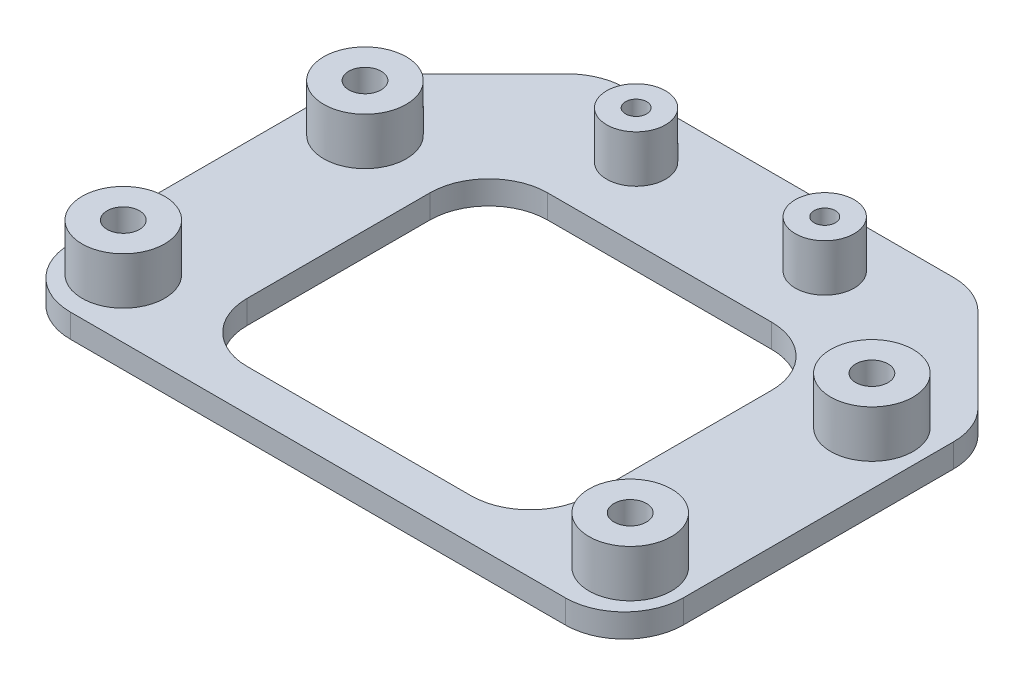
ISO-10303-21;
HEADER;
FILE_DESCRIPTION(('STEP AP214'),'2;1');
FILE_NAME('part.step','',(''),(''),'','','');
FILE_SCHEMA(('AUTOMOTIVE_DESIGN { 1 0 10303 214 1 1 1 1 }'));
ENDSEC;
DATA;
#1=APPLICATION_CONTEXT('core data for automotive mechanical design processes');
#2=APPLICATION_PROTOCOL_DEFINITION('international standard','automotive_design',2000,#1);
#3=PRODUCT_CONTEXT('',#1,'mechanical');
#4=PRODUCT('Part','Part','',(#3));
#5=PRODUCT_RELATED_PRODUCT_CATEGORY('part','',(#4));
#6=PRODUCT_DEFINITION_FORMATION('','',#4);
#7=PRODUCT_DEFINITION_CONTEXT('part definition',#1,'design');
#8=PRODUCT_DEFINITION('design','',#6,#7);
#9=PRODUCT_DEFINITION_SHAPE('','',#8);
#10=(LENGTH_UNIT() NAMED_UNIT(*) SI_UNIT(.MILLI.,.METRE.));
#11=(NAMED_UNIT(*) PLANE_ANGLE_UNIT() SI_UNIT($,.RADIAN.));
#12=(NAMED_UNIT(*) SI_UNIT($,.STERADIAN.) SOLID_ANGLE_UNIT());
#13=UNCERTAINTY_MEASURE_WITH_UNIT(LENGTH_MEASURE(1.E-05),#10,'distance_accuracy_value','');
#14=(GEOMETRIC_REPRESENTATION_CONTEXT(3) GLOBAL_UNCERTAINTY_ASSIGNED_CONTEXT((#13)) GLOBAL_UNIT_ASSIGNED_CONTEXT((#10,
#11,#12)) REPRESENTATION_CONTEXT('',''));
#15=CARTESIAN_POINT('',(0.,0.,0.));
#16=DIRECTION('',(0.,0.,1.));
#17=DIRECTION('',(1.,0.,0.));
#18=AXIS2_PLACEMENT_3D('',#15,#16,#17);
#19=CARTESIAN_POINT('',(0.,2.,0.));
#20=DIRECTION('',(0.,-1.,0.));
#21=DIRECTION('',(0.,0.,-1.));
#22=AXIS2_PLACEMENT_3D('',#19,#20,#21);
#23=PLANE('',#22);
#24=DIRECTION('',(-1.,0.,0.));
#25=VECTOR('',#24,1.);
#26=CARTESIAN_POINT('',(-14.5,2.,-9.00000000000001));
#27=LINE('',#26,#25);
#28=CARTESIAN_POINT('',(9.49999999999999,2.,-9.00000000000001));
#29=VERTEX_POINT('',#28);
#30=CARTESIAN_POINT('',(-9.5,2.,-9.00000000000001));
#31=VERTEX_POINT('',#30);
#32=EDGE_CURVE('E217',#29,#31,#27,.T.);
#33=ORIENTED_EDGE('',*,*,#32,.F.);
#34=CARTESIAN_POINT('',(9.5,2.,-4.));
#35=DIRECTION('',(0.,-1.,0.));
#36=DIRECTION('',(0.,0.,-1.));
#37=AXIS2_PLACEMENT_3D('',#34,#35,#36);
#38=CIRCLE('',#37,5.);
#39=CARTESIAN_POINT('',(14.5,2.,-4.));
#40=VERTEX_POINT('',#39);
#41=EDGE_CURVE('E465',#29,#40,#38,.T.);
#42=ORIENTED_EDGE('',*,*,#41,.T.);
#43=DIRECTION('',(0.,0.,-1.));
#44=VECTOR('',#43,1.);
#45=CARTESIAN_POINT('',(14.5,2.,16.5));
#46=LINE('',#45,#44);
#47=CARTESIAN_POINT('',(14.5,2.,11.5));
#48=VERTEX_POINT('',#47);
#49=EDGE_CURVE('E481',#48,#40,#46,.T.);
#50=ORIENTED_EDGE('',*,*,#49,.F.);
#51=CARTESIAN_POINT('',(9.5,2.,11.5));
#52=DIRECTION('',(0.,-1.,0.));
#53=DIRECTION('',(0.,0.,-1.));
#54=AXIS2_PLACEMENT_3D('',#51,#52,#53);
#55=CIRCLE('',#54,5.);
#56=CARTESIAN_POINT('',(9.5,2.,16.5));
#57=VERTEX_POINT('',#56);
#58=EDGE_CURVE('E207',#48,#57,#55,.T.);
#59=ORIENTED_EDGE('',*,*,#58,.T.);
#60=DIRECTION('',(1.,0.,0.));
#61=VECTOR('',#60,1.);
#62=CARTESIAN_POINT('',(-14.5,2.,16.5));
#63=LINE('',#62,#61);
#64=CARTESIAN_POINT('',(-9.5,2.,16.5));
#65=VERTEX_POINT('',#64);
#66=EDGE_CURVE('E196',#65,#57,#63,.T.);
#67=ORIENTED_EDGE('',*,*,#66,.F.);
#68=CARTESIAN_POINT('',(-9.5,2.,11.5));
#69=DIRECTION('',(0.,-1.,0.));
#70=DIRECTION('',(0.,0.,-1.));
#71=AXIS2_PLACEMENT_3D('',#68,#69,#70);
#72=CIRCLE('',#71,5.);
#73=CARTESIAN_POINT('',(-14.5,2.,11.5));
#74=VERTEX_POINT('',#73);
#75=EDGE_CURVE('E178',#65,#74,#72,.T.);
#76=ORIENTED_EDGE('',*,*,#75,.T.);
#77=DIRECTION('',(0.,0.,1.));
#78=VECTOR('',#77,1.);
#79=CARTESIAN_POINT('',(-14.5,2.,16.5));
#80=LINE('',#79,#78);
#81=CARTESIAN_POINT('',(-14.5,2.,-4.));
#82=VERTEX_POINT('',#81);
#83=EDGE_CURVE('E210',#82,#74,#80,.T.);
#84=ORIENTED_EDGE('',*,*,#83,.F.);
#85=CARTESIAN_POINT('',(-9.5,2.,-4.));
#86=DIRECTION('',(0.,-1.,0.));
#87=DIRECTION('',(0.,0.,-1.));
#88=AXIS2_PLACEMENT_3D('',#85,#86,#87);
#89=CIRCLE('',#88,5.);
#90=EDGE_CURVE('E48',#82,#31,#89,.T.);
#91=ORIENTED_EDGE('',*,*,#90,.T.);
#92=EDGE_LOOP('',(#33,#42,#50,#59,#67,#76,#84,#91));
#93=FACE_BOUND('',#92,.T.);
#94=CARTESIAN_POINT('',(8.,2.,-15.));
#95=DIRECTION('',(0.,-1.,0.));
#96=DIRECTION('',(0.,0.,-1.));
#97=AXIS2_PLACEMENT_3D('',#94,#95,#96);
#98=CIRCLE('',#97,2.5);
#99=CARTESIAN_POINT('',(8.,2.,-17.5));
#100=VERTEX_POINT('',#99);
#101=EDGE_CURVE('E338',#100,#100,#98,.F.);
#102=ORIENTED_EDGE('',*,*,#101,.F.);
#103=EDGE_LOOP('',(#102));
#104=FACE_BOUND('',#103,.T.);
#105=CARTESIAN_POINT('',(21.5,2.,15.));
#106=DIRECTION('',(0.,-1.,0.));
#107=DIRECTION('',(0.,0.,-1.));
#108=AXIS2_PLACEMENT_3D('',#105,#106,#107);
#109=CIRCLE('',#108,3.5);
#110=CARTESIAN_POINT('',(21.5,2.,11.5));
#111=VERTEX_POINT('',#110);
#112=EDGE_CURVE('E330',#111,#111,#109,.F.);
#113=ORIENTED_EDGE('',*,*,#112,.F.);
#114=EDGE_LOOP('',(#113));
#115=FACE_BOUND('',#114,.T.);
#116=CARTESIAN_POINT('',(-21.5,2.,-5.5));
#117=DIRECTION('',(0.,-1.,0.));
#118=DIRECTION('',(0.,0.,-1.));
#119=AXIS2_PLACEMENT_3D('',#116,#117,#118);
#120=CIRCLE('',#119,3.5);
#121=CARTESIAN_POINT('',(-21.5,2.,-9.));
#122=VERTEX_POINT('',#121);
#123=EDGE_CURVE('E309',#122,#122,#120,.F.);
#124=ORIENTED_EDGE('',*,*,#123,.F.);
#125=EDGE_LOOP('',(#124));
#126=FACE_BOUND('',#125,.T.);
#127=DIRECTION('',(0.707106781186548,0.,-0.707106781186547));
#128=VECTOR('',#127,1.);
#129=CARTESIAN_POINT('',(-26.,2.,-10.));
#130=LINE('',#129,#128);
#131=CARTESIAN_POINT('',(-17.4644660940672,2.,-18.5355339059327));
#132=VERTEX_POINT('',#131);
#133=CARTESIAN_POINT('',(-24.5355339059327,2.,-11.4644660940673));
#134=VERTEX_POINT('',#133);
#135=EDGE_CURVE('E354',#132,#134,#130,.F.);
#136=ORIENTED_EDGE('',*,*,#135,.T.);
#137=CARTESIAN_POINT('',(-21.,2.,-7.92893218813452));
#138=DIRECTION('',(0.,-1.,0.));
#139=DIRECTION('',(0.,0.,-1.));
#140=AXIS2_PLACEMENT_3D('',#137,#138,#139);
#141=CIRCLE('',#140,5.);
#142=CARTESIAN_POINT('',(-26.,2.,-7.92893218813452));
#143=VERTEX_POINT('',#142);
#144=EDGE_CURVE('E428',#134,#143,#141,.F.);
#145=ORIENTED_EDGE('',*,*,#144,.T.);
#146=DIRECTION('',(0.,0.,1.));
#147=VECTOR('',#146,1.);
#148=CARTESIAN_POINT('',(-26.,2.,20.));
#149=LINE('',#148,#147);
#150=CARTESIAN_POINT('',(-26.,2.,15.));
#151=VERTEX_POINT('',#150);
#152=EDGE_CURVE('E303',#143,#151,#149,.T.);
#153=ORIENTED_EDGE('',*,*,#152,.T.);
#154=CARTESIAN_POINT('',(-21.,2.,15.));
#155=DIRECTION('',(0.,-1.,0.));
#156=DIRECTION('',(0.,0.,-1.));
#157=AXIS2_PLACEMENT_3D('',#154,#155,#156);
#158=CIRCLE('',#157,5.);
#159=CARTESIAN_POINT('',(-21.,2.,20.));
#160=VERTEX_POINT('',#159);
#161=EDGE_CURVE('E62',#151,#160,#158,.F.);
#162=ORIENTED_EDGE('',*,*,#161,.T.);
#163=DIRECTION('',(1.,0.,0.));
#164=VECTOR('',#163,1.);
#165=CARTESIAN_POINT('',(-26.,2.,20.));
#166=LINE('',#165,#164);
#167=CARTESIAN_POINT('',(21.,2.,20.));
#168=VERTEX_POINT('',#167);
#169=EDGE_CURVE('E306',#160,#168,#166,.T.);
#170=ORIENTED_EDGE('',*,*,#169,.T.);
#171=CARTESIAN_POINT('',(21.,2.,15.));
#172=DIRECTION('',(0.,-1.,0.));
#173=DIRECTION('',(0.,0.,-1.));
#174=AXIS2_PLACEMENT_3D('',#171,#172,#173);
#175=CIRCLE('',#174,5.);
#176=CARTESIAN_POINT('',(26.,2.,15.));
#177=VERTEX_POINT('',#176);
#178=EDGE_CURVE('E423',#168,#177,#175,.F.);
#179=ORIENTED_EDGE('',*,*,#178,.T.);
#180=DIRECTION('',(0.,0.,-1.));
#181=VECTOR('',#180,1.);
#182=CARTESIAN_POINT('',(26.,2.,20.));
#183=LINE('',#182,#181);
#184=CARTESIAN_POINT('',(26.,2.,-7.9289321881345));
#185=VERTEX_POINT('',#184);
#186=EDGE_CURVE('E294',#177,#185,#183,.T.);
#187=ORIENTED_EDGE('',*,*,#186,.T.);
#188=CARTESIAN_POINT('',(21.,2.,-7.9289321881345));
#189=DIRECTION('',(0.,-1.,0.));
#190=DIRECTION('',(0.,0.,-1.));
#191=AXIS2_PLACEMENT_3D('',#188,#189,#190);
#192=CIRCLE('',#191,5.);
#193=CARTESIAN_POINT('',(24.5355339059327,2.,-11.4644660940672));
#194=VERTEX_POINT('',#193);
#195=EDGE_CURVE('E420',#185,#194,#192,.F.);
#196=ORIENTED_EDGE('',*,*,#195,.T.);
#197=DIRECTION('',(0.707106781186547,0.,0.707106781186548));
#198=VECTOR('',#197,1.);
#199=CARTESIAN_POINT('',(16.,2.,-20.));
#200=LINE('',#199,#198);
#201=CARTESIAN_POINT('',(17.4644660940673,2.,-18.5355339059327));
#202=VERTEX_POINT('',#201);
#203=EDGE_CURVE('E358',#194,#202,#200,.F.);
#204=ORIENTED_EDGE('',*,*,#203,.T.);
#205=CARTESIAN_POINT('',(13.9289321881345,2.,-15.));
#206=DIRECTION('',(0.,-1.,0.));
#207=DIRECTION('',(0.,0.,-1.));
#208=AXIS2_PLACEMENT_3D('',#205,#206,#207);
#209=CIRCLE('',#208,5.);
#210=CARTESIAN_POINT('',(13.9289321881345,2.,-20.));
#211=VERTEX_POINT('',#210);
#212=EDGE_CURVE('E417',#202,#211,#209,.F.);
#213=ORIENTED_EDGE('',*,*,#212,.T.);
#214=DIRECTION('',(-1.,0.,0.));
#215=VECTOR('',#214,1.);
#216=CARTESIAN_POINT('',(-26.,2.,-20.));
#217=LINE('',#216,#215);
#218=CARTESIAN_POINT('',(-13.9289321881345,2.,-20.));
#219=VERTEX_POINT('',#218);
#220=EDGE_CURVE('E298',#211,#219,#217,.T.);
#221=ORIENTED_EDGE('',*,*,#220,.T.);
#222=CARTESIAN_POINT('',(-13.9289321881345,2.,-15.));
#223=DIRECTION('',(0.,-1.,0.));
#224=DIRECTION('',(0.,0.,-1.));
#225=AXIS2_PLACEMENT_3D('',#222,#223,#224);
#226=CIRCLE('',#225,5.);
#227=EDGE_CURVE('E414',#219,#132,#226,.F.);
#228=ORIENTED_EDGE('',*,*,#227,.T.);
#229=EDGE_LOOP('',(#136,#145,#153,#162,#170,#179,#187,#196,#204,#213,#221,#228));
#230=FACE_BOUND('',#229,.T.);
#231=CARTESIAN_POINT('',(-21.5,2.,15.));
#232=DIRECTION('',(0.,-1.,0.));
#233=DIRECTION('',(0.,0.,-1.));
#234=AXIS2_PLACEMENT_3D('',#231,#232,#233);
#235=CIRCLE('',#234,3.5);
#236=CARTESIAN_POINT('',(-21.5,2.,11.5));
#237=VERTEX_POINT('',#236);
#238=EDGE_CURVE('E326',#237,#237,#235,.F.);
#239=ORIENTED_EDGE('',*,*,#238,.F.);
#240=EDGE_LOOP('',(#239));
#241=FACE_BOUND('',#240,.T.);
#242=CARTESIAN_POINT('',(21.5,2.,-5.5));
#243=DIRECTION('',(0.,-1.,0.));
#244=DIRECTION('',(0.,0.,-1.));
#245=AXIS2_PLACEMENT_3D('',#242,#243,#244);
#246=CIRCLE('',#245,3.5);
#247=CARTESIAN_POINT('',(21.5,2.,-9.));
#248=VERTEX_POINT('',#247);
#249=EDGE_CURVE('E334',#248,#248,#246,.F.);
#250=ORIENTED_EDGE('',*,*,#249,.F.);
#251=EDGE_LOOP('',(#250));
#252=FACE_BOUND('',#251,.T.);
#253=CARTESIAN_POINT('',(-8.,2.,-15.));
#254=DIRECTION('',(0.,-1.,0.));
#255=DIRECTION('',(0.,0.,-1.));
#256=AXIS2_PLACEMENT_3D('',#253,#254,#255);
#257=CIRCLE('',#256,2.5);
#258=CARTESIAN_POINT('',(-8.,2.,-17.5));
#259=VERTEX_POINT('',#258);
#260=EDGE_CURVE('E342',#259,#259,#257,.F.);
#261=ORIENTED_EDGE('',*,*,#260,.F.);
#262=EDGE_LOOP('',(#261));
#263=FACE_BOUND('',#262,.T.);
#264=ADVANCED_FACE('F39',(#93,#104,#115,#126,#230,#241,#252,#263),#23,.F.);
#265=CARTESIAN_POINT('',(26.,2.,20.));
#266=DIRECTION('',(-1.,0.,0.));
#267=DIRECTION('',(0.,0.,1.));
#268=AXIS2_PLACEMENT_3D('',#265,#266,#267);
#269=PLANE('',#268);
#270=ORIENTED_EDGE('',*,*,#186,.F.);
#271=DIRECTION('',(0.,-1.,0.));
#272=VECTOR('',#271,1.);
#273=CARTESIAN_POINT('',(26.,2.,15.));
#274=LINE('',#273,#272);
#275=CARTESIAN_POINT('',(26.,0.,15.));
#276=VERTEX_POINT('',#275);
#277=EDGE_CURVE('E441',#177,#276,#274,.T.);
#278=ORIENTED_EDGE('',*,*,#277,.T.);
#279=DIRECTION('',(0.,0.,-1.));
#280=VECTOR('',#279,1.);
#281=CARTESIAN_POINT('',(26.,0.,20.));
#282=LINE('',#281,#280);
#283=CARTESIAN_POINT('',(26.,0.,-7.9289321881345));
#284=VERTEX_POINT('',#283);
#285=EDGE_CURVE('E293',#276,#284,#282,.T.);
#286=ORIENTED_EDGE('',*,*,#285,.T.);
#287=DIRECTION('',(0.,-1.,0.));
#288=VECTOR('',#287,1.);
#289=CARTESIAN_POINT('',(26.,2.,-7.9289321881345));
#290=LINE('',#289,#288);
#291=EDGE_CURVE('E437',#284,#185,#290,.F.);
#292=ORIENTED_EDGE('',*,*,#291,.T.);
#293=EDGE_LOOP('',(#270,#278,#286,#292));
#294=FACE_BOUND('',#293,.T.);
#295=ADVANCED_FACE('F522',(#294),#269,.F.);
#296=CARTESIAN_POINT('',(-26.,2.,-20.));
#297=DIRECTION('',(0.,0.,1.));
#298=DIRECTION('',(1.,0.,0.));
#299=AXIS2_PLACEMENT_3D('',#296,#297,#298);
#300=PLANE('',#299);
#301=ORIENTED_EDGE('',*,*,#220,.F.);
#302=DIRECTION('',(0.,1.,0.));
#303=VECTOR('',#302,1.);
#304=CARTESIAN_POINT('',(13.9289321881345,0.,-20.));
#305=LINE('',#304,#303);
#306=CARTESIAN_POINT('',(13.9289321881345,0.,-20.));
#307=VERTEX_POINT('',#306);
#308=EDGE_CURVE('E190',#211,#307,#305,.F.);
#309=ORIENTED_EDGE('',*,*,#308,.T.);
#310=DIRECTION('',(-1.,0.,0.));
#311=VECTOR('',#310,1.);
#312=CARTESIAN_POINT('',(-26.,0.,-20.));
#313=LINE('',#312,#311);
#314=CARTESIAN_POINT('',(-13.9289321881345,0.,-20.));
#315=VERTEX_POINT('',#314);
#316=EDGE_CURVE('E313',#307,#315,#313,.T.);
#317=ORIENTED_EDGE('',*,*,#316,.T.);
#318=DIRECTION('',(0.,-1.,0.));
#319=VECTOR('',#318,1.);
#320=CARTESIAN_POINT('',(-13.9289321881345,2.,-20.));
#321=LINE('',#320,#319);
#322=EDGE_CURVE('E451',#315,#219,#321,.F.);
#323=ORIENTED_EDGE('',*,*,#322,.T.);
#324=EDGE_LOOP('',(#301,#309,#317,#323));
#325=FACE_BOUND('',#324,.T.);
#326=ADVANCED_FACE('F527',(#325),#300,.F.);
#327=CARTESIAN_POINT('',(-26.,2.,20.));
#328=DIRECTION('',(1.,0.,0.));
#329=DIRECTION('',(0.,0.,-1.));
#330=AXIS2_PLACEMENT_3D('',#327,#328,#329);
#331=PLANE('',#330);
#332=ORIENTED_EDGE('',*,*,#152,.F.);
#333=DIRECTION('',(0.,1.,0.));
#334=VECTOR('',#333,1.);
#335=CARTESIAN_POINT('',(-26.,0.,-7.92893218813452));
#336=LINE('',#335,#334);
#337=CARTESIAN_POINT('',(-26.,0.,-7.92893218813452));
#338=VERTEX_POINT('',#337);
#339=EDGE_CURVE('E386',#143,#338,#336,.F.);
#340=ORIENTED_EDGE('',*,*,#339,.T.);
#341=DIRECTION('',(0.,0.,1.));
#342=VECTOR('',#341,1.);
#343=CARTESIAN_POINT('',(-26.,0.,20.));
#344=LINE('',#343,#342);
#345=CARTESIAN_POINT('',(-26.,0.,15.));
#346=VERTEX_POINT('',#345);
#347=EDGE_CURVE('E317',#338,#346,#344,.T.);
#348=ORIENTED_EDGE('',*,*,#347,.T.);
#349=DIRECTION('',(0.,-1.,0.));
#350=VECTOR('',#349,1.);
#351=CARTESIAN_POINT('',(-26.,2.,15.));
#352=LINE('',#351,#350);
#353=EDGE_CURVE('E383',#346,#151,#352,.F.);
#354=ORIENTED_EDGE('',*,*,#353,.T.);
#355=EDGE_LOOP('',(#332,#340,#348,#354));
#356=FACE_BOUND('',#355,.T.);
#357=ADVANCED_FACE('F539',(#356),#331,.F.);
#358=CARTESIAN_POINT('',(-26.,2.,20.));
#359=DIRECTION('',(0.,0.,-1.));
#360=DIRECTION('',(-1.,0.,0.));
#361=AXIS2_PLACEMENT_3D('',#358,#359,#360);
#362=PLANE('',#361);
#363=ORIENTED_EDGE('',*,*,#169,.F.);
#364=DIRECTION('',(0.,-1.,0.));
#365=VECTOR('',#364,1.);
#366=CARTESIAN_POINT('',(-21.,2.,20.));
#367=LINE('',#366,#365);
#368=CARTESIAN_POINT('',(-21.,0.,20.));
#369=VERTEX_POINT('',#368);
#370=EDGE_CURVE('E433',#160,#369,#367,.T.);
#371=ORIENTED_EDGE('',*,*,#370,.T.);
#372=DIRECTION('',(1.,0.,0.));
#373=VECTOR('',#372,1.);
#374=CARTESIAN_POINT('',(-26.,0.,20.));
#375=LINE('',#374,#373);
#376=CARTESIAN_POINT('',(21.,0.,20.));
#377=VERTEX_POINT('',#376);
#378=EDGE_CURVE('E299',#369,#377,#375,.T.);
#379=ORIENTED_EDGE('',*,*,#378,.T.);
#380=DIRECTION('',(0.,-1.,0.));
#381=VECTOR('',#380,1.);
#382=CARTESIAN_POINT('',(21.,2.,20.));
#383=LINE('',#382,#381);
#384=EDGE_CURVE('E55',#377,#168,#383,.F.);
#385=ORIENTED_EDGE('',*,*,#384,.T.);
#386=EDGE_LOOP('',(#363,#371,#379,#385));
#387=FACE_BOUND('',#386,.T.);
#388=ADVANCED_FACE('F536',(#387),#362,.F.);
#389=CARTESIAN_POINT('',(0.,0.,0.));
#390=DIRECTION('',(0.,-1.,0.));
#391=DIRECTION('',(0.,0.,-1.));
#392=AXIS2_PLACEMENT_3D('',#389,#390,#391);
#393=PLANE('',#392);
#394=DIRECTION('',(1.,0.,0.));
#395=VECTOR('',#394,1.);
#396=CARTESIAN_POINT('',(-14.5,0.,16.5));
#397=LINE('',#396,#395);
#398=CARTESIAN_POINT('',(-9.5,0.,16.5));
#399=VERTEX_POINT('',#398);
#400=CARTESIAN_POINT('',(9.5,0.,16.5));
#401=VERTEX_POINT('',#400);
#402=EDGE_CURVE('E199',#399,#401,#397,.T.);
#403=ORIENTED_EDGE('',*,*,#402,.T.);
#404=CARTESIAN_POINT('',(9.5,0.,11.5));
#405=DIRECTION('',(0.,-1.,0.));
#406=DIRECTION('',(0.,0.,-1.));
#407=AXIS2_PLACEMENT_3D('',#404,#405,#406);
#408=CIRCLE('',#407,5.);
#409=CARTESIAN_POINT('',(14.5,0.,11.5));
#410=VERTEX_POINT('',#409);
#411=EDGE_CURVE('E462',#401,#410,#408,.F.);
#412=ORIENTED_EDGE('',*,*,#411,.T.);
#413=DIRECTION('',(0.,0.,-1.));
#414=VECTOR('',#413,1.);
#415=CARTESIAN_POINT('',(14.5,0.,16.5));
#416=LINE('',#415,#414);
#417=CARTESIAN_POINT('',(14.5,0.,-4.));
#418=VERTEX_POINT('',#417);
#419=EDGE_CURVE('E209',#410,#418,#416,.T.);
#420=ORIENTED_EDGE('',*,*,#419,.T.);
#421=CARTESIAN_POINT('',(9.5,0.,-4.));
#422=DIRECTION('',(0.,-1.,0.));
#423=DIRECTION('',(0.,0.,-1.));
#424=AXIS2_PLACEMENT_3D('',#421,#422,#423);
#425=CIRCLE('',#424,5.);
#426=CARTESIAN_POINT('',(9.49999999999999,0.,-9.00000000000001));
#427=VERTEX_POINT('',#426);
#428=EDGE_CURVE('E468',#418,#427,#425,.F.);
#429=ORIENTED_EDGE('',*,*,#428,.T.);
#430=DIRECTION('',(-1.,0.,0.));
#431=VECTOR('',#430,1.);
#432=CARTESIAN_POINT('',(-14.5,0.,-9.00000000000001));
#433=LINE('',#432,#431);
#434=CARTESIAN_POINT('',(-9.5,0.,-9.00000000000001));
#435=VERTEX_POINT('',#434);
#436=EDGE_CURVE('E215',#427,#435,#433,.T.);
#437=ORIENTED_EDGE('',*,*,#436,.T.);
#438=CARTESIAN_POINT('',(-9.5,0.,-4.));
#439=DIRECTION('',(0.,-1.,0.));
#440=DIRECTION('',(0.,0.,-1.));
#441=AXIS2_PLACEMENT_3D('',#438,#439,#440);
#442=CIRCLE('',#441,5.);
#443=CARTESIAN_POINT('',(-14.5,0.,-4.));
#444=VERTEX_POINT('',#443);
#445=EDGE_CURVE('E11',#435,#444,#442,.F.);
#446=ORIENTED_EDGE('',*,*,#445,.T.);
#447=DIRECTION('',(0.,0.,1.));
#448=VECTOR('',#447,1.);
#449=CARTESIAN_POINT('',(-14.5,0.,16.5));
#450=LINE('',#449,#448);
#451=CARTESIAN_POINT('',(-14.5,0.,11.5));
#452=VERTEX_POINT('',#451);
#453=EDGE_CURVE('E489',#444,#452,#450,.T.);
#454=ORIENTED_EDGE('',*,*,#453,.T.);
#455=CARTESIAN_POINT('',(-9.5,0.,11.5));
#456=DIRECTION('',(0.,-1.,0.));
#457=DIRECTION('',(0.,0.,-1.));
#458=AXIS2_PLACEMENT_3D('',#455,#456,#457);
#459=CIRCLE('',#458,5.);
#460=EDGE_CURVE('E189',#452,#399,#459,.F.);
#461=ORIENTED_EDGE('',*,*,#460,.T.);
#462=EDGE_LOOP('',(#403,#412,#420,#429,#437,#446,#454,#461));
#463=FACE_BOUND('',#462,.T.);
#464=CARTESIAN_POINT('',(-8.,0.,-15.));
#465=DIRECTION('',(0.,1.,0.));
#466=DIRECTION('',(0.,0.,1.));
#467=AXIS2_PLACEMENT_3D('',#464,#465,#466);
#468=CIRCLE('',#467,0.899999999999999);
#469=CARTESIAN_POINT('',(-8.,0.,-14.1));
#470=VERTEX_POINT('',#469);
#471=EDGE_CURVE('E274',#470,#470,#468,.T.);
#472=ORIENTED_EDGE('',*,*,#471,.T.);
#473=EDGE_LOOP('',(#472));
#474=FACE_BOUND('',#473,.T.);
#475=CARTESIAN_POINT('',(-21.5,0.,-5.5));
#476=DIRECTION('',(0.,1.,0.));
#477=DIRECTION('',(0.,0.,1.));
#478=AXIS2_PLACEMENT_3D('',#475,#476,#477);
#479=CIRCLE('',#478,1.375);
#480=CARTESIAN_POINT('',(-21.5,0.,-4.125));
#481=VERTEX_POINT('',#480);
#482=EDGE_CURVE('E279',#481,#481,#479,.T.);
#483=ORIENTED_EDGE('',*,*,#482,.T.);
#484=EDGE_LOOP('',(#483));
#485=FACE_BOUND('',#484,.T.);
#486=CARTESIAN_POINT('',(-21.5,0.,15.));
#487=DIRECTION('',(0.,1.,0.));
#488=DIRECTION('',(0.,0.,1.));
#489=AXIS2_PLACEMENT_3D('',#486,#487,#488);
#490=CIRCLE('',#489,1.375);
#491=CARTESIAN_POINT('',(-21.5,0.,16.375));
#492=VERTEX_POINT('',#491);
#493=EDGE_CURVE('E283',#492,#492,#490,.T.);
#494=ORIENTED_EDGE('',*,*,#493,.T.);
#495=EDGE_LOOP('',(#494));
#496=FACE_BOUND('',#495,.T.);
#497=CARTESIAN_POINT('',(21.5,0.,15.));
#498=DIRECTION('',(0.,1.,0.));
#499=DIRECTION('',(0.,0.,1.));
#500=AXIS2_PLACEMENT_3D('',#497,#498,#499);
#501=CIRCLE('',#500,1.375);
#502=CARTESIAN_POINT('',(21.5,0.,16.375));
#503=VERTEX_POINT('',#502);
#504=EDGE_CURVE('E273',#503,#503,#501,.T.);
#505=ORIENTED_EDGE('',*,*,#504,.T.);
#506=EDGE_LOOP('',(#505));
#507=FACE_BOUND('',#506,.T.);
#508=CARTESIAN_POINT('',(21.5,0.,-5.5));
#509=DIRECTION('',(0.,1.,0.));
#510=DIRECTION('',(0.,0.,1.));
#511=AXIS2_PLACEMENT_3D('',#508,#509,#510);
#512=CIRCLE('',#511,1.375);
#513=CARTESIAN_POINT('',(21.5,0.,-4.125));
#514=VERTEX_POINT('',#513);
#515=EDGE_CURVE('E269',#514,#514,#512,.T.);
#516=ORIENTED_EDGE('',*,*,#515,.T.);
#517=EDGE_LOOP('',(#516));
#518=FACE_BOUND('',#517,.T.);
#519=CARTESIAN_POINT('',(8.,0.,-15.));
#520=DIRECTION('',(0.,1.,0.));
#521=DIRECTION('',(0.,0.,1.));
#522=AXIS2_PLACEMENT_3D('',#519,#520,#521);
#523=CIRCLE('',#522,0.9);
#524=CARTESIAN_POINT('',(8.,0.,-14.1));
#525=VERTEX_POINT('',#524);
#526=EDGE_CURVE('E278',#525,#525,#523,.T.);
#527=ORIENTED_EDGE('',*,*,#526,.T.);
#528=EDGE_LOOP('',(#527));
#529=FACE_BOUND('',#528,.T.);
#530=ORIENTED_EDGE('',*,*,#347,.F.);
#531=CARTESIAN_POINT('',(-21.,0.,-7.92893218813452));
#532=DIRECTION('',(0.,-1.,0.));
#533=DIRECTION('',(0.,0.,-1.));
#534=AXIS2_PLACEMENT_3D('',#531,#532,#533);
#535=CIRCLE('',#534,5.);
#536=CARTESIAN_POINT('',(-24.5355339059327,0.,-11.4644660940673));
#537=VERTEX_POINT('',#536);
#538=EDGE_CURVE('E405',#338,#537,#535,.T.);
#539=ORIENTED_EDGE('',*,*,#538,.T.);
#540=DIRECTION('',(-0.707106781186548,0.,0.707106781186547));
#541=VECTOR('',#540,1.);
#542=CARTESIAN_POINT('',(-18.,0.,-18.));
#543=LINE('',#542,#541);
#544=CARTESIAN_POINT('',(-17.4644660940672,0.,-18.5355339059327));
#545=VERTEX_POINT('',#544);
#546=EDGE_CURVE('E346',#537,#545,#543,.F.);
#547=ORIENTED_EDGE('',*,*,#546,.T.);
#548=CARTESIAN_POINT('',(-13.9289321881345,0.,-15.));
#549=DIRECTION('',(0.,-1.,0.));
#550=DIRECTION('',(0.,0.,-1.));
#551=AXIS2_PLACEMENT_3D('',#548,#549,#550);
#552=CIRCLE('',#551,5.);
#553=EDGE_CURVE('E390',#545,#315,#552,.T.);
#554=ORIENTED_EDGE('',*,*,#553,.T.);
#555=ORIENTED_EDGE('',*,*,#316,.F.);
#556=CARTESIAN_POINT('',(13.9289321881345,0.,-15.));
#557=DIRECTION('',(0.,-1.,0.));
#558=DIRECTION('',(0.,0.,-1.));
#559=AXIS2_PLACEMENT_3D('',#556,#557,#558);
#560=CIRCLE('',#559,5.);
#561=CARTESIAN_POINT('',(17.4644660940673,0.,-18.5355339059327));
#562=VERTEX_POINT('',#561);
#563=EDGE_CURVE('E393',#307,#562,#560,.T.);
#564=ORIENTED_EDGE('',*,*,#563,.T.);
#565=DIRECTION('',(-0.707106781186547,0.,-0.707106781186548));
#566=VECTOR('',#565,1.);
#567=CARTESIAN_POINT('',(18.,0.,-18.));
#568=LINE('',#567,#566);
#569=CARTESIAN_POINT('',(24.5355339059327,0.,-11.4644660940672));
#570=VERTEX_POINT('',#569);
#571=EDGE_CURVE('E350',#562,#570,#568,.F.);
#572=ORIENTED_EDGE('',*,*,#571,.T.);
#573=CARTESIAN_POINT('',(21.,0.,-7.9289321881345));
#574=DIRECTION('',(0.,-1.,0.));
#575=DIRECTION('',(0.,0.,-1.));
#576=AXIS2_PLACEMENT_3D('',#573,#574,#575);
#577=CIRCLE('',#576,5.);
#578=EDGE_CURVE('E396',#570,#284,#577,.T.);
#579=ORIENTED_EDGE('',*,*,#578,.T.);
#580=ORIENTED_EDGE('',*,*,#285,.F.);
#581=CARTESIAN_POINT('',(21.,0.,15.));
#582=DIRECTION('',(0.,-1.,0.));
#583=DIRECTION('',(0.,0.,-1.));
#584=AXIS2_PLACEMENT_3D('',#581,#582,#583);
#585=CIRCLE('',#584,5.);
#586=EDGE_CURVE('E399',#276,#377,#585,.T.);
#587=ORIENTED_EDGE('',*,*,#586,.T.);
#588=ORIENTED_EDGE('',*,*,#378,.F.);
#589=CARTESIAN_POINT('',(-21.,0.,15.));
#590=DIRECTION('',(0.,-1.,0.));
#591=DIRECTION('',(0.,0.,-1.));
#592=AXIS2_PLACEMENT_3D('',#589,#590,#591);
#593=CIRCLE('',#592,5.);
#594=EDGE_CURVE('E402',#369,#346,#593,.T.);
#595=ORIENTED_EDGE('',*,*,#594,.T.);
#596=EDGE_LOOP('',(#530,#539,#547,#554,#555,#564,#572,#579,#580,#587,#588,#595));
#597=FACE_BOUND('',#596,.T.);
#598=ADVANCED_FACE('F487',(#463,#474,#485,#496,#507,#518,#529,#597),#393,.T.);
#599=CARTESIAN_POINT('',(8.,0.,-15.));
#600=DIRECTION('',(0.,1.,0.));
#601=DIRECTION('',(0.,0.,1.));
#602=AXIS2_PLACEMENT_3D('',#599,#600,#601);
#603=CYLINDRICAL_SURFACE('',#602,0.9);
#604=ORIENTED_EDGE('',*,*,#526,.F.);
#605=EDGE_LOOP('',(#604));
#606=FACE_BOUND('',#605,.T.);
#607=CARTESIAN_POINT('',(8.,6.,-15.));
#608=DIRECTION('',(0.,1.,0.));
#609=DIRECTION('',(0.,0.,1.));
#610=AXIS2_PLACEMENT_3D('',#607,#608,#609);
#611=CIRCLE('',#610,0.9);
#612=CARTESIAN_POINT('',(8.,6.,-14.1));
#613=VERTEX_POINT('',#612);
#614=EDGE_CURVE('E229',#613,#613,#611,.T.);
#615=ORIENTED_EDGE('',*,*,#614,.T.);
#616=EDGE_LOOP('',(#615));
#617=FACE_BOUND('',#616,.T.);
#618=ADVANCED_FACE('F532',(#606,#617),#603,.F.);
#619=CARTESIAN_POINT('',(21.5,0.,-5.5));
#620=DIRECTION('',(0.,1.,0.));
#621=DIRECTION('',(0.,0.,1.));
#622=AXIS2_PLACEMENT_3D('',#619,#620,#621);
#623=CYLINDRICAL_SURFACE('',#622,1.375);
#624=ORIENTED_EDGE('',*,*,#515,.F.);
#625=EDGE_LOOP('',(#624));
#626=FACE_BOUND('',#625,.T.);
#627=CARTESIAN_POINT('',(21.5,6.,-5.5));
#628=DIRECTION('',(0.,1.,0.));
#629=DIRECTION('',(0.,0.,1.));
#630=AXIS2_PLACEMENT_3D('',#627,#628,#629);
#631=CIRCLE('',#630,1.375);
#632=CARTESIAN_POINT('',(21.5,6.,-4.125));
#633=VERTEX_POINT('',#632);
#634=EDGE_CURVE('E237',#633,#633,#631,.T.);
#635=ORIENTED_EDGE('',*,*,#634,.T.);
#636=EDGE_LOOP('',(#635));
#637=FACE_BOUND('',#636,.T.);
#638=ADVANCED_FACE('F854',(#626,#637),#623,.F.);
#639=CARTESIAN_POINT('',(21.5,0.,15.));
#640=DIRECTION('',(0.,1.,0.));
#641=DIRECTION('',(0.,0.,1.));
#642=AXIS2_PLACEMENT_3D('',#639,#640,#641);
#643=CYLINDRICAL_SURFACE('',#642,1.375);
#644=ORIENTED_EDGE('',*,*,#504,.F.);
#645=EDGE_LOOP('',(#644));
#646=FACE_BOUND('',#645,.T.);
#647=CARTESIAN_POINT('',(21.5,6.,15.));
#648=DIRECTION('',(0.,1.,0.));
#649=DIRECTION('',(0.,0.,1.));
#650=AXIS2_PLACEMENT_3D('',#647,#648,#649);
#651=CIRCLE('',#650,1.375);
#652=CARTESIAN_POINT('',(21.5,6.,16.375));
#653=VERTEX_POINT('',#652);
#654=EDGE_CURVE('E245',#653,#653,#651,.T.);
#655=ORIENTED_EDGE('',*,*,#654,.T.);
#656=EDGE_LOOP('',(#655));
#657=FACE_BOUND('',#656,.T.);
#658=ADVANCED_FACE('F842',(#646,#657),#643,.F.);
#659=CARTESIAN_POINT('',(-21.5,0.,15.));
#660=DIRECTION('',(0.,1.,0.));
#661=DIRECTION('',(0.,0.,1.));
#662=AXIS2_PLACEMENT_3D('',#659,#660,#661);
#663=CYLINDRICAL_SURFACE('',#662,1.375);
#664=ORIENTED_EDGE('',*,*,#493,.F.);
#665=EDGE_LOOP('',(#664));
#666=FACE_BOUND('',#665,.T.);
#667=CARTESIAN_POINT('',(-21.5,6.,15.));
#668=DIRECTION('',(0.,1.,0.));
#669=DIRECTION('',(0.,0.,1.));
#670=AXIS2_PLACEMENT_3D('',#667,#668,#669);
#671=CIRCLE('',#670,1.375);
#672=CARTESIAN_POINT('',(-21.5,6.,16.375));
#673=VERTEX_POINT('',#672);
#674=EDGE_CURVE('E253',#673,#673,#671,.T.);
#675=ORIENTED_EDGE('',*,*,#674,.T.);
#676=EDGE_LOOP('',(#675));
#677=FACE_BOUND('',#676,.T.);
#678=ADVANCED_FACE('F830',(#666,#677),#663,.F.);
#679=CARTESIAN_POINT('',(-21.5,0.,-5.5));
#680=DIRECTION('',(0.,1.,0.));
#681=DIRECTION('',(0.,0.,1.));
#682=AXIS2_PLACEMENT_3D('',#679,#680,#681);
#683=CYLINDRICAL_SURFACE('',#682,1.375);
#684=ORIENTED_EDGE('',*,*,#482,.F.);
#685=EDGE_LOOP('',(#684));
#686=FACE_BOUND('',#685,.T.);
#687=CARTESIAN_POINT('',(-21.5,6.,-5.5));
#688=DIRECTION('',(0.,1.,0.));
#689=DIRECTION('',(0.,0.,1.));
#690=AXIS2_PLACEMENT_3D('',#687,#688,#689);
#691=CIRCLE('',#690,1.375);
#692=CARTESIAN_POINT('',(-21.5,6.,-4.125));
#693=VERTEX_POINT('',#692);
#694=EDGE_CURVE('E261',#693,#693,#691,.T.);
#695=ORIENTED_EDGE('',*,*,#694,.T.);
#696=EDGE_LOOP('',(#695));
#697=FACE_BOUND('',#696,.T.);
#698=ADVANCED_FACE('F817',(#686,#697),#683,.F.);
#699=CARTESIAN_POINT('',(-8.,0.,-15.));
#700=DIRECTION('',(0.,1.,0.));
#701=DIRECTION('',(0.,0.,1.));
#702=AXIS2_PLACEMENT_3D('',#699,#700,#701);
#703=CYLINDRICAL_SURFACE('',#702,0.899999999999999);
#704=ORIENTED_EDGE('',*,*,#471,.F.);
#705=EDGE_LOOP('',(#704));
#706=FACE_BOUND('',#705,.T.);
#707=CARTESIAN_POINT('',(-8.,6.,-15.));
#708=DIRECTION('',(0.,1.,0.));
#709=DIRECTION('',(0.,0.,1.));
#710=AXIS2_PLACEMENT_3D('',#707,#708,#709);
#711=CIRCLE('',#710,0.899999999999999);
#712=CARTESIAN_POINT('',(-8.,6.,-14.1));
#713=VERTEX_POINT('',#712);
#714=EDGE_CURVE('E221',#713,#713,#711,.T.);
#715=ORIENTED_EDGE('',*,*,#714,.T.);
#716=EDGE_LOOP('',(#715));
#717=FACE_BOUND('',#716,.T.);
#718=ADVANCED_FACE('F807',(#706,#717),#703,.F.);
#719=CARTESIAN_POINT('',(-21.5,6.,-5.5));
#720=DIRECTION('',(0.,1.,0.));
#721=DIRECTION('',(0.,0.,1.));
#722=AXIS2_PLACEMENT_3D('',#719,#720,#721);
#723=PLANE('',#722);
#724=CARTESIAN_POINT('',(-21.5,6.,-5.5));
#725=DIRECTION('',(0.,1.,0.));
#726=DIRECTION('',(0.,0.,1.));
#727=AXIS2_PLACEMENT_3D('',#724,#725,#726);
#728=CIRCLE('',#727,3.5);
#729=CARTESIAN_POINT('',(-21.5,6.,-2.));
#730=VERTEX_POINT('',#729);
#731=EDGE_CURVE('E265',#730,#730,#728,.T.);
#732=ORIENTED_EDGE('',*,*,#731,.T.);
#733=EDGE_LOOP('',(#732));
#734=FACE_BOUND('',#733,.T.);
#735=ORIENTED_EDGE('',*,*,#694,.F.);
#736=EDGE_LOOP('',(#735));
#737=FACE_BOUND('',#736,.T.);
#738=ADVANCED_FACE('F798',(#734,#737),#723,.T.);
#739=CARTESIAN_POINT('',(-21.5,6.,-5.5));
#740=DIRECTION('',(0.,-1.,0.));
#741=DIRECTION('',(0.,0.,-1.));
#742=AXIS2_PLACEMENT_3D('',#739,#740,#741);
#743=CYLINDRICAL_SURFACE('',#742,3.5);
#744=ORIENTED_EDGE('',*,*,#731,.F.);
#745=EDGE_LOOP('',(#744));
#746=FACE_BOUND('',#745,.T.);
#747=ORIENTED_EDGE('',*,*,#123,.T.);
#748=EDGE_LOOP('',(#747));
#749=FACE_BOUND('',#748,.T.);
#750=ADVANCED_FACE('F789',(#746,#749),#743,.T.);
#751=CARTESIAN_POINT('',(-21.5,6.,15.));
#752=DIRECTION('',(0.,1.,0.));
#753=DIRECTION('',(0.,0.,1.));
#754=AXIS2_PLACEMENT_3D('',#751,#752,#753);
#755=PLANE('',#754);
#756=CARTESIAN_POINT('',(-21.5,6.,15.));
#757=DIRECTION('',(0.,1.,0.));
#758=DIRECTION('',(0.,0.,1.));
#759=AXIS2_PLACEMENT_3D('',#756,#757,#758);
#760=CIRCLE('',#759,3.5);
#761=CARTESIAN_POINT('',(-21.5,6.,18.5));
#762=VERTEX_POINT('',#761);
#763=EDGE_CURVE('E257',#762,#762,#760,.T.);
#764=ORIENTED_EDGE('',*,*,#763,.T.);
#765=EDGE_LOOP('',(#764));
#766=FACE_BOUND('',#765,.T.);
#767=ORIENTED_EDGE('',*,*,#674,.F.);
#768=EDGE_LOOP('',(#767));
#769=FACE_BOUND('',#768,.T.);
#770=ADVANCED_FACE('F780',(#766,#769),#755,.T.);
#771=CARTESIAN_POINT('',(-21.5,6.,15.));
#772=DIRECTION('',(0.,-1.,0.));
#773=DIRECTION('',(0.,0.,-1.));
#774=AXIS2_PLACEMENT_3D('',#771,#772,#773);
#775=CYLINDRICAL_SURFACE('',#774,3.5);
#776=ORIENTED_EDGE('',*,*,#763,.F.);
#777=EDGE_LOOP('',(#776));
#778=FACE_BOUND('',#777,.T.);
#779=ORIENTED_EDGE('',*,*,#238,.T.);
#780=EDGE_LOOP('',(#779));
#781=FACE_BOUND('',#780,.T.);
#782=ADVANCED_FACE('F771',(#778,#781),#775,.T.);
#783=CARTESIAN_POINT('',(21.5,6.,15.));
#784=DIRECTION('',(0.,1.,0.));
#785=DIRECTION('',(0.,0.,1.));
#786=AXIS2_PLACEMENT_3D('',#783,#784,#785);
#787=PLANE('',#786);
#788=CARTESIAN_POINT('',(21.5,6.,15.));
#789=DIRECTION('',(0.,1.,0.));
#790=DIRECTION('',(0.,0.,1.));
#791=AXIS2_PLACEMENT_3D('',#788,#789,#790);
#792=CIRCLE('',#791,3.5);
#793=CARTESIAN_POINT('',(21.5,6.,18.5));
#794=VERTEX_POINT('',#793);
#795=EDGE_CURVE('E249',#794,#794,#792,.T.);
#796=ORIENTED_EDGE('',*,*,#795,.T.);
#797=EDGE_LOOP('',(#796));
#798=FACE_BOUND('',#797,.T.);
#799=ORIENTED_EDGE('',*,*,#654,.F.);
#800=EDGE_LOOP('',(#799));
#801=FACE_BOUND('',#800,.T.);
#802=ADVANCED_FACE('F762',(#798,#801),#787,.T.);
#803=CARTESIAN_POINT('',(21.5,6.,15.));
#804=DIRECTION('',(0.,-1.,0.));
#805=DIRECTION('',(0.,0.,-1.));
#806=AXIS2_PLACEMENT_3D('',#803,#804,#805);
#807=CYLINDRICAL_SURFACE('',#806,3.5);
#808=ORIENTED_EDGE('',*,*,#795,.F.);
#809=EDGE_LOOP('',(#808));
#810=FACE_BOUND('',#809,.T.);
#811=ORIENTED_EDGE('',*,*,#112,.T.);
#812=EDGE_LOOP('',(#811));
#813=FACE_BOUND('',#812,.T.);
#814=ADVANCED_FACE('F753',(#810,#813),#807,.T.);
#815=CARTESIAN_POINT('',(21.5,6.,-5.5));
#816=DIRECTION('',(0.,1.,0.));
#817=DIRECTION('',(0.,0.,1.));
#818=AXIS2_PLACEMENT_3D('',#815,#816,#817);
#819=PLANE('',#818);
#820=CARTESIAN_POINT('',(21.5,6.,-5.5));
#821=DIRECTION('',(0.,1.,0.));
#822=DIRECTION('',(0.,0.,1.));
#823=AXIS2_PLACEMENT_3D('',#820,#821,#822);
#824=CIRCLE('',#823,3.5);
#825=CARTESIAN_POINT('',(21.5,6.,-2.));
#826=VERTEX_POINT('',#825);
#827=EDGE_CURVE('E241',#826,#826,#824,.T.);
#828=ORIENTED_EDGE('',*,*,#827,.T.);
#829=EDGE_LOOP('',(#828));
#830=FACE_BOUND('',#829,.T.);
#831=ORIENTED_EDGE('',*,*,#634,.F.);
#832=EDGE_LOOP('',(#831));
#833=FACE_BOUND('',#832,.T.);
#834=ADVANCED_FACE('F744',(#830,#833),#819,.T.);
#835=CARTESIAN_POINT('',(21.5,6.,-5.5));
#836=DIRECTION('',(0.,-1.,0.));
#837=DIRECTION('',(0.,0.,-1.));
#838=AXIS2_PLACEMENT_3D('',#835,#836,#837);
#839=CYLINDRICAL_SURFACE('',#838,3.5);
#840=ORIENTED_EDGE('',*,*,#827,.F.);
#841=EDGE_LOOP('',(#840));
#842=FACE_BOUND('',#841,.T.);
#843=ORIENTED_EDGE('',*,*,#249,.T.);
#844=EDGE_LOOP('',(#843));
#845=FACE_BOUND('',#844,.T.);
#846=ADVANCED_FACE('F735',(#842,#845),#839,.T.);
#847=CARTESIAN_POINT('',(8.,6.,-15.));
#848=DIRECTION('',(0.,1.,0.));
#849=DIRECTION('',(0.,0.,1.));
#850=AXIS2_PLACEMENT_3D('',#847,#848,#849);
#851=PLANE('',#850);
#852=CARTESIAN_POINT('',(8.,6.,-15.));
#853=DIRECTION('',(0.,1.,0.));
#854=DIRECTION('',(0.,0.,1.));
#855=AXIS2_PLACEMENT_3D('',#852,#853,#854);
#856=CIRCLE('',#855,2.5);
#857=CARTESIAN_POINT('',(8.,6.,-12.5));
#858=VERTEX_POINT('',#857);
#859=EDGE_CURVE('E233',#858,#858,#856,.T.);
#860=ORIENTED_EDGE('',*,*,#859,.T.);
#861=EDGE_LOOP('',(#860));
#862=FACE_BOUND('',#861,.T.);
#863=ORIENTED_EDGE('',*,*,#614,.F.);
#864=EDGE_LOOP('',(#863));
#865=FACE_BOUND('',#864,.T.);
#866=ADVANCED_FACE('F726',(#862,#865),#851,.T.);
#867=CARTESIAN_POINT('',(8.,6.,-15.));
#868=DIRECTION('',(0.,-1.,0.));
#869=DIRECTION('',(0.,0.,-1.));
#870=AXIS2_PLACEMENT_3D('',#867,#868,#869);
#871=CYLINDRICAL_SURFACE('',#870,2.5);
#872=ORIENTED_EDGE('',*,*,#859,.F.);
#873=EDGE_LOOP('',(#872));
#874=FACE_BOUND('',#873,.T.);
#875=ORIENTED_EDGE('',*,*,#101,.T.);
#876=EDGE_LOOP('',(#875));
#877=FACE_BOUND('',#876,.T.);
#878=ADVANCED_FACE('F717',(#874,#877),#871,.T.);
#879=CARTESIAN_POINT('',(-8.,6.,-15.));
#880=DIRECTION('',(0.,1.,0.));
#881=DIRECTION('',(0.,0.,1.));
#882=AXIS2_PLACEMENT_3D('',#879,#880,#881);
#883=PLANE('',#882);
#884=CARTESIAN_POINT('',(-8.,6.,-15.));
#885=DIRECTION('',(0.,1.,0.));
#886=DIRECTION('',(0.,0.,1.));
#887=AXIS2_PLACEMENT_3D('',#884,#885,#886);
#888=CIRCLE('',#887,2.5);
#889=CARTESIAN_POINT('',(-8.,6.,-12.5));
#890=VERTEX_POINT('',#889);
#891=EDGE_CURVE('E225',#890,#890,#888,.T.);
#892=ORIENTED_EDGE('',*,*,#891,.T.);
#893=EDGE_LOOP('',(#892));
#894=FACE_BOUND('',#893,.T.);
#895=ORIENTED_EDGE('',*,*,#714,.F.);
#896=EDGE_LOOP('',(#895));
#897=FACE_BOUND('',#896,.T.);
#898=ADVANCED_FACE('F708',(#894,#897),#883,.T.);
#899=CARTESIAN_POINT('',(-8.,6.,-15.));
#900=DIRECTION('',(0.,-1.,0.));
#901=DIRECTION('',(0.,0.,-1.));
#902=AXIS2_PLACEMENT_3D('',#899,#900,#901);
#903=CYLINDRICAL_SURFACE('',#902,2.5);
#904=ORIENTED_EDGE('',*,*,#891,.F.);
#905=EDGE_LOOP('',(#904));
#906=FACE_BOUND('',#905,.T.);
#907=ORIENTED_EDGE('',*,*,#260,.T.);
#908=EDGE_LOOP('',(#907));
#909=FACE_BOUND('',#908,.T.);
#910=ADVANCED_FACE('F699',(#906,#909),#903,.T.);
#911=CARTESIAN_POINT('',(14.5,0.,16.5));
#912=DIRECTION('',(1.,0.,0.));
#913=DIRECTION('',(0.,0.,-1.));
#914=AXIS2_PLACEMENT_3D('',#911,#912,#913);
#915=PLANE('',#914);
#916=ORIENTED_EDGE('',*,*,#419,.F.);
#917=DIRECTION('',(0.,1.,0.));
#918=VECTOR('',#917,1.);
#919=CARTESIAN_POINT('',(14.5,2.,11.5));
#920=LINE('',#919,#918);
#921=EDGE_CURVE('E372',#410,#48,#920,.T.);
#922=ORIENTED_EDGE('',*,*,#921,.T.);
#923=ORIENTED_EDGE('',*,*,#49,.T.);
#924=DIRECTION('',(0.,1.,0.));
#925=VECTOR('',#924,1.);
#926=CARTESIAN_POINT('',(14.5,0.,-4.));
#927=LINE('',#926,#925);
#928=EDGE_CURVE('E369',#40,#418,#927,.F.);
#929=ORIENTED_EDGE('',*,*,#928,.T.);
#930=EDGE_LOOP('',(#916,#922,#923,#929));
#931=FACE_BOUND('',#930,.T.);
#932=ADVANCED_FACE('F504',(#931),#915,.F.);
#933=CARTESIAN_POINT('',(-14.5,0.,16.5));
#934=DIRECTION('',(0.,0.,1.));
#935=DIRECTION('',(1.,0.,0.));
#936=AXIS2_PLACEMENT_3D('',#933,#934,#935);
#937=PLANE('',#936);
#938=ORIENTED_EDGE('',*,*,#402,.F.);
#939=DIRECTION('',(0.,1.,0.));
#940=VECTOR('',#939,1.);
#941=CARTESIAN_POINT('',(-9.5,2.,16.5));
#942=LINE('',#941,#940);
#943=EDGE_CURVE('E182',#399,#65,#942,.T.);
#944=ORIENTED_EDGE('',*,*,#943,.T.);
#945=ORIENTED_EDGE('',*,*,#66,.T.);
#946=DIRECTION('',(0.,1.,0.));
#947=VECTOR('',#946,1.);
#948=CARTESIAN_POINT('',(9.5,0.,16.5));
#949=LINE('',#948,#947);
#950=EDGE_CURVE('E202',#57,#401,#949,.F.);
#951=ORIENTED_EDGE('',*,*,#950,.T.);
#952=EDGE_LOOP('',(#938,#944,#945,#951));
#953=FACE_BOUND('',#952,.T.);
#954=ADVANCED_FACE('F195',(#953),#937,.F.);
#955=CARTESIAN_POINT('',(-14.5,0.,16.5));
#956=DIRECTION('',(-1.,0.,0.));
#957=DIRECTION('',(0.,0.,1.));
#958=AXIS2_PLACEMENT_3D('',#955,#956,#957);
#959=PLANE('',#958);
#960=ORIENTED_EDGE('',*,*,#83,.T.);
#961=DIRECTION('',(0.,1.,0.));
#962=VECTOR('',#961,1.);
#963=CARTESIAN_POINT('',(-14.5,0.,11.5));
#964=LINE('',#963,#962);
#965=EDGE_CURVE('E183',#74,#452,#964,.F.);
#966=ORIENTED_EDGE('',*,*,#965,.T.);
#967=ORIENTED_EDGE('',*,*,#453,.F.);
#968=DIRECTION('',(0.,1.,0.));
#969=VECTOR('',#968,1.);
#970=CARTESIAN_POINT('',(-14.5,2.,-4.));
#971=LINE('',#970,#969);
#972=EDGE_CURVE('E201',#444,#82,#971,.T.);
#973=ORIENTED_EDGE('',*,*,#972,.T.);
#974=EDGE_LOOP('',(#960,#966,#967,#973));
#975=FACE_BOUND('',#974,.T.);
#976=ADVANCED_FACE('F491',(#975),#959,.F.);
#977=CARTESIAN_POINT('',(-14.5,0.,-9.00000000000001));
#978=DIRECTION('',(0.,0.,-1.));
#979=DIRECTION('',(-1.,0.,0.));
#980=AXIS2_PLACEMENT_3D('',#977,#978,#979);
#981=PLANE('',#980);
#982=ORIENTED_EDGE('',*,*,#436,.F.);
#983=DIRECTION('',(0.,1.,0.));
#984=VECTOR('',#983,1.);
#985=CARTESIAN_POINT('',(9.5,2.,-9.00000000000001));
#986=LINE('',#985,#984);
#987=EDGE_CURVE('E379',#427,#29,#986,.T.);
#988=ORIENTED_EDGE('',*,*,#987,.T.);
#989=ORIENTED_EDGE('',*,*,#32,.T.);
#990=DIRECTION('',(0.,1.,0.));
#991=VECTOR('',#990,1.);
#992=CARTESIAN_POINT('',(-9.5,0.,-9.00000000000001));
#993=LINE('',#992,#991);
#994=EDGE_CURVE('E376',#31,#435,#993,.F.);
#995=ORIENTED_EDGE('',*,*,#994,.T.);
#996=EDGE_LOOP('',(#982,#988,#989,#995));
#997=FACE_BOUND('',#996,.T.);
#998=ADVANCED_FACE('F477',(#997),#981,.F.);
#999=CARTESIAN_POINT('',(16.,2.,-20.));
#1000=DIRECTION('',(-0.707106781186548,0.,0.707106781186547));
#1001=DIRECTION('',(0.,-1.,0.));
#1002=AXIS2_PLACEMENT_3D('',#999,#1000,#1001);
#1003=PLANE('',#1002);
#1004=ORIENTED_EDGE('',*,*,#203,.F.);
#1005=DIRECTION('',(0.,1.,0.));
#1006=VECTOR('',#1005,1.);
#1007=CARTESIAN_POINT('',(24.5355339059327,0.,-11.4644660940672));
#1008=LINE('',#1007,#1006);
#1009=EDGE_CURVE('E448',#194,#570,#1008,.F.);
#1010=ORIENTED_EDGE('',*,*,#1009,.T.);
#1011=ORIENTED_EDGE('',*,*,#571,.F.);
#1012=DIRECTION('',(0.,-1.,0.));
#1013=VECTOR('',#1012,1.);
#1014=CARTESIAN_POINT('',(17.4644660940673,2.,-18.5355339059327));
#1015=LINE('',#1014,#1013);
#1016=EDGE_CURVE('E445',#562,#202,#1015,.F.);
#1017=ORIENTED_EDGE('',*,*,#1016,.T.);
#1018=EDGE_LOOP('',(#1004,#1010,#1011,#1017));
#1019=FACE_BOUND('',#1018,.T.);
#1020=ADVANCED_FACE('F546',(#1019),#1003,.F.);
#1021=CARTESIAN_POINT('',(-26.,2.,-10.));
#1022=DIRECTION('',(0.707106781186547,0.,0.707106781186548));
#1023=DIRECTION('',(0.,-1.,0.));
#1024=AXIS2_PLACEMENT_3D('',#1021,#1022,#1023);
#1025=PLANE('',#1024);
#1026=ORIENTED_EDGE('',*,*,#546,.F.);
#1027=DIRECTION('',(0.,-1.,0.));
#1028=VECTOR('',#1027,1.);
#1029=CARTESIAN_POINT('',(-24.5355339059327,2.,-11.4644660940673));
#1030=LINE('',#1029,#1028);
#1031=EDGE_CURVE('E411',#537,#134,#1030,.F.);
#1032=ORIENTED_EDGE('',*,*,#1031,.T.);
#1033=ORIENTED_EDGE('',*,*,#135,.F.);
#1034=DIRECTION('',(0.,1.,0.));
#1035=VECTOR('',#1034,1.);
#1036=CARTESIAN_POINT('',(-17.4644660940672,0.,-18.5355339059327));
#1037=LINE('',#1036,#1035);
#1038=EDGE_CURVE('E408',#132,#545,#1037,.F.);
#1039=ORIENTED_EDGE('',*,*,#1038,.T.);
#1040=EDGE_LOOP('',(#1026,#1032,#1033,#1039));
#1041=FACE_BOUND('',#1040,.T.);
#1042=ADVANCED_FACE('F519',(#1041),#1025,.F.);
#1043=CARTESIAN_POINT('',(-9.5,0.,11.5));
#1044=DIRECTION('',(0.,-1.,0.));
#1045=DIRECTION('',(0.,0.,-1.));
#1046=AXIS2_PLACEMENT_3D('',#1043,#1044,#1045);
#1047=CYLINDRICAL_SURFACE('',#1046,5.);
#1048=ORIENTED_EDGE('',*,*,#460,.F.);
#1049=ORIENTED_EDGE('',*,*,#965,.F.);
#1050=ORIENTED_EDGE('',*,*,#75,.F.);
#1051=ORIENTED_EDGE('',*,*,#943,.F.);
#1052=EDGE_LOOP('',(#1048,#1049,#1050,#1051));
#1053=FACE_BOUND('',#1052,.T.);
#1054=ADVANCED_FACE('F181',(#1053),#1047,.F.);
#1055=CARTESIAN_POINT('',(9.5,0.,11.5));
#1056=DIRECTION('',(0.,-1.,0.));
#1057=DIRECTION('',(0.,0.,-1.));
#1058=AXIS2_PLACEMENT_3D('',#1055,#1056,#1057);
#1059=CYLINDRICAL_SURFACE('',#1058,5.);
#1060=ORIENTED_EDGE('',*,*,#411,.F.);
#1061=ORIENTED_EDGE('',*,*,#950,.F.);
#1062=ORIENTED_EDGE('',*,*,#58,.F.);
#1063=ORIENTED_EDGE('',*,*,#921,.F.);
#1064=EDGE_LOOP('',(#1060,#1061,#1062,#1063));
#1065=FACE_BOUND('',#1064,.T.);
#1066=ADVANCED_FACE('F511',(#1065),#1059,.F.);
#1067=CARTESIAN_POINT('',(9.5,0.,-4.));
#1068=DIRECTION('',(0.,-1.,0.));
#1069=DIRECTION('',(0.,0.,-1.));
#1070=AXIS2_PLACEMENT_3D('',#1067,#1068,#1069);
#1071=CYLINDRICAL_SURFACE('',#1070,5.);
#1072=ORIENTED_EDGE('',*,*,#428,.F.);
#1073=ORIENTED_EDGE('',*,*,#928,.F.);
#1074=ORIENTED_EDGE('',*,*,#41,.F.);
#1075=ORIENTED_EDGE('',*,*,#987,.F.);
#1076=EDGE_LOOP('',(#1072,#1073,#1074,#1075));
#1077=FACE_BOUND('',#1076,.T.);
#1078=ADVANCED_FACE('F508',(#1077),#1071,.F.);
#1079=CARTESIAN_POINT('',(-9.5,0.,-4.));
#1080=DIRECTION('',(0.,-1.,0.));
#1081=DIRECTION('',(0.,0.,-1.));
#1082=AXIS2_PLACEMENT_3D('',#1079,#1080,#1081);
#1083=CYLINDRICAL_SURFACE('',#1082,5.);
#1084=ORIENTED_EDGE('',*,*,#445,.F.);
#1085=ORIENTED_EDGE('',*,*,#994,.F.);
#1086=ORIENTED_EDGE('',*,*,#90,.F.);
#1087=ORIENTED_EDGE('',*,*,#972,.F.);
#1088=EDGE_LOOP('',(#1084,#1085,#1086,#1087));
#1089=FACE_BOUND('',#1088,.T.);
#1090=ADVANCED_FACE('F483',(#1089),#1083,.F.);
#1091=CARTESIAN_POINT('',(-21.,2.,-7.92893218813452));
#1092=DIRECTION('',(0.,-1.,0.));
#1093=DIRECTION('',(0.,0.,-1.));
#1094=AXIS2_PLACEMENT_3D('',#1091,#1092,#1093);
#1095=CYLINDRICAL_SURFACE('',#1094,5.);
#1096=ORIENTED_EDGE('',*,*,#144,.F.);
#1097=ORIENTED_EDGE('',*,*,#1031,.F.);
#1098=ORIENTED_EDGE('',*,*,#538,.F.);
#1099=ORIENTED_EDGE('',*,*,#339,.F.);
#1100=EDGE_LOOP('',(#1096,#1097,#1098,#1099));
#1101=FACE_BOUND('',#1100,.T.);
#1102=ADVANCED_FACE('F562',(#1101),#1095,.T.);
#1103=CARTESIAN_POINT('',(-21.,2.,15.));
#1104=DIRECTION('',(0.,-1.,0.));
#1105=DIRECTION('',(0.,0.,-1.));
#1106=AXIS2_PLACEMENT_3D('',#1103,#1104,#1105);
#1107=CYLINDRICAL_SURFACE('',#1106,5.);
#1108=ORIENTED_EDGE('',*,*,#161,.F.);
#1109=ORIENTED_EDGE('',*,*,#353,.F.);
#1110=ORIENTED_EDGE('',*,*,#594,.F.);
#1111=ORIENTED_EDGE('',*,*,#370,.F.);
#1112=EDGE_LOOP('',(#1108,#1109,#1110,#1111));
#1113=FACE_BOUND('',#1112,.T.);
#1114=ADVANCED_FACE('F569',(#1113),#1107,.T.);
#1115=CARTESIAN_POINT('',(21.,2.,15.));
#1116=DIRECTION('',(0.,-1.,0.));
#1117=DIRECTION('',(0.,0.,-1.));
#1118=AXIS2_PLACEMENT_3D('',#1115,#1116,#1117);
#1119=CYLINDRICAL_SURFACE('',#1118,5.);
#1120=ORIENTED_EDGE('',*,*,#178,.F.);
#1121=ORIENTED_EDGE('',*,*,#384,.F.);
#1122=ORIENTED_EDGE('',*,*,#586,.F.);
#1123=ORIENTED_EDGE('',*,*,#277,.F.);
#1124=EDGE_LOOP('',(#1120,#1121,#1122,#1123));
#1125=FACE_BOUND('',#1124,.T.);
#1126=ADVANCED_FACE('F576',(#1125),#1119,.T.);
#1127=CARTESIAN_POINT('',(21.,2.,-7.9289321881345));
#1128=DIRECTION('',(0.,1.,0.));
#1129=DIRECTION('',(0.,0.,1.));
#1130=AXIS2_PLACEMENT_3D('',#1127,#1128,#1129);
#1131=CYLINDRICAL_SURFACE('',#1130,5.);
#1132=ORIENTED_EDGE('',*,*,#578,.F.);
#1133=ORIENTED_EDGE('',*,*,#1009,.F.);
#1134=ORIENTED_EDGE('',*,*,#195,.F.);
#1135=ORIENTED_EDGE('',*,*,#291,.F.);
#1136=EDGE_LOOP('',(#1132,#1133,#1134,#1135));
#1137=FACE_BOUND('',#1136,.T.);
#1138=ADVANCED_FACE('F586',(#1137),#1131,.T.);
#1139=CARTESIAN_POINT('',(13.9289321881345,2.,-15.));
#1140=DIRECTION('',(0.,-1.,0.));
#1141=DIRECTION('',(0.,0.,-1.));
#1142=AXIS2_PLACEMENT_3D('',#1139,#1140,#1141);
#1143=CYLINDRICAL_SURFACE('',#1142,5.);
#1144=ORIENTED_EDGE('',*,*,#212,.F.);
#1145=ORIENTED_EDGE('',*,*,#1016,.F.);
#1146=ORIENTED_EDGE('',*,*,#563,.F.);
#1147=ORIENTED_EDGE('',*,*,#308,.F.);
#1148=EDGE_LOOP('',(#1144,#1145,#1146,#1147));
#1149=FACE_BOUND('',#1148,.T.);
#1150=ADVANCED_FACE('F589',(#1149),#1143,.T.);
#1151=CARTESIAN_POINT('',(-13.9289321881345,2.,-15.));
#1152=DIRECTION('',(0.,1.,0.));
#1153=DIRECTION('',(0.,0.,1.));
#1154=AXIS2_PLACEMENT_3D('',#1151,#1152,#1153);
#1155=CYLINDRICAL_SURFACE('',#1154,5.);
#1156=ORIENTED_EDGE('',*,*,#553,.F.);
#1157=ORIENTED_EDGE('',*,*,#1038,.F.);
#1158=ORIENTED_EDGE('',*,*,#227,.F.);
#1159=ORIENTED_EDGE('',*,*,#322,.F.);
#1160=EDGE_LOOP('',(#1156,#1157,#1158,#1159));
#1161=FACE_BOUND('',#1160,.T.);
#1162=ADVANCED_FACE('F41',(#1161),#1155,.T.);
#1163=CLOSED_SHELL('',(#264,#295,#326,#357,#388,#598,#618,#638,#658,#678,#698,#718,#738,#750,
#770,#782,#802,#814,#834,#846,#866,#878,#898,#910,#932,#954,#976,#998,#1020,#1042,#1054,#1066,
#1078,#1090,#1102,#1114,#1126,#1138,#1150,#1162));
#1164=MANIFOLD_SOLID_BREP('B2',#1163);
#1165=ADVANCED_BREP_SHAPE_REPRESENTATION('',(#18,#1164),#14);
#1166=SHAPE_DEFINITION_REPRESENTATION(#9,#1165);
ENDSEC;
END-ISO-10303-21;
